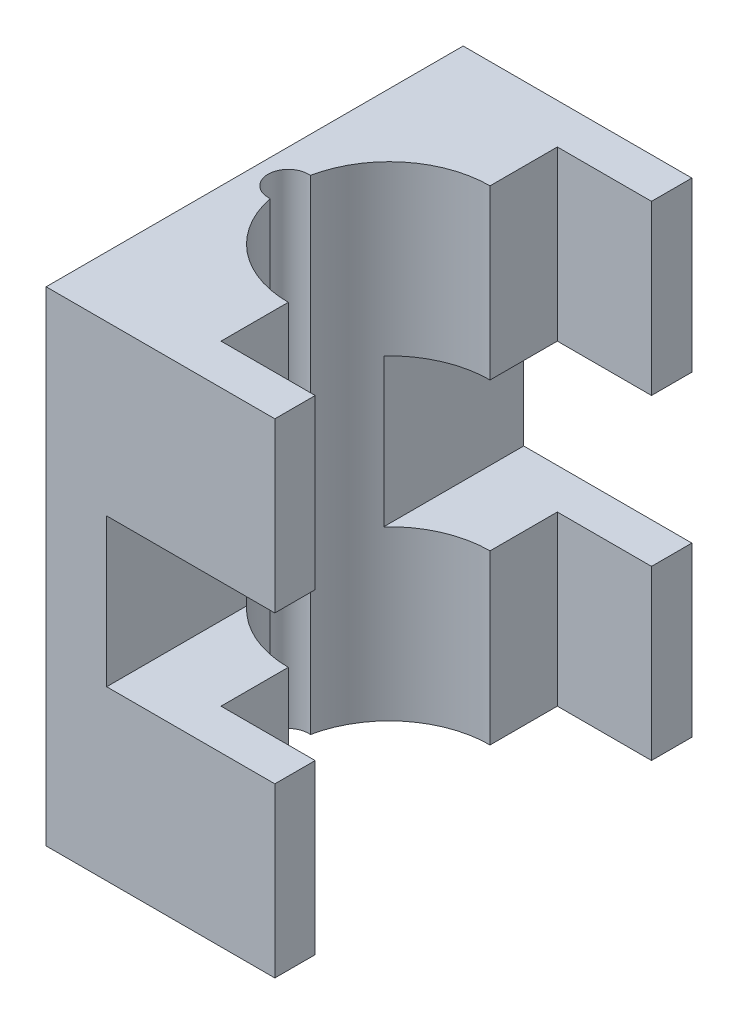
ISO-10303-21;
HEADER;
FILE_DESCRIPTION(('STEP AP214'),'2;1');
FILE_NAME('part.step','',(''),(''),'','','');
FILE_SCHEMA(('AUTOMOTIVE_DESIGN { 1 0 10303 214 1 1 1 1 }'));
ENDSEC;
DATA;
#1=APPLICATION_CONTEXT('core data for automotive mechanical design processes');
#2=APPLICATION_PROTOCOL_DEFINITION('international standard','automotive_design',2000,#1);
#3=PRODUCT_CONTEXT('',#1,'mechanical');
#4=PRODUCT('Part','Part','',(#3));
#5=PRODUCT_RELATED_PRODUCT_CATEGORY('part','',(#4));
#6=PRODUCT_DEFINITION_FORMATION('','',#4);
#7=PRODUCT_DEFINITION_CONTEXT('part definition',#1,'design');
#8=PRODUCT_DEFINITION('design','',#6,#7);
#9=PRODUCT_DEFINITION_SHAPE('','',#8);
#10=(LENGTH_UNIT() NAMED_UNIT(*) SI_UNIT(.MILLI.,.METRE.));
#11=(NAMED_UNIT(*) PLANE_ANGLE_UNIT() SI_UNIT($,.RADIAN.));
#12=(NAMED_UNIT(*) SI_UNIT($,.STERADIAN.) SOLID_ANGLE_UNIT());
#13=UNCERTAINTY_MEASURE_WITH_UNIT(LENGTH_MEASURE(1.E-05),#10,'distance_accuracy_value','');
#14=(GEOMETRIC_REPRESENTATION_CONTEXT(3) GLOBAL_UNCERTAINTY_ASSIGNED_CONTEXT((#13)) GLOBAL_UNIT_ASSIGNED_CONTEXT((#10,
#11,#12)) REPRESENTATION_CONTEXT('',''));
#15=CARTESIAN_POINT('',(0.,0.,0.));
#16=DIRECTION('',(0.,0.,1.));
#17=DIRECTION('',(1.,0.,0.));
#18=AXIS2_PLACEMENT_3D('',#15,#16,#17);
#19=CARTESIAN_POINT('',(0.,25.,0.));
#20=DIRECTION('',(0.,1.,0.));
#21=DIRECTION('',(0.,0.,1.));
#22=AXIS2_PLACEMENT_3D('',#19,#20,#21);
#23=PLANE('',#22);
#24=DIRECTION('',(-1.,0.,0.));
#25=VECTOR('',#24,1.);
#26=CARTESIAN_POINT('',(0.,25.,-31.));
#27=LINE('',#26,#25);
#28=CARTESIAN_POINT('',(14.,25.,-31.));
#29=VERTEX_POINT('',#28);
#30=CARTESIAN_POINT('',(-11.,25.,-31.));
#31=VERTEX_POINT('',#30);
#32=EDGE_CURVE('E71',#29,#31,#27,.T.);
#33=ORIENTED_EDGE('',*,*,#32,.T.);
#34=DIRECTION('',(0.,0.,1.));
#35=VECTOR('',#34,1.);
#36=CARTESIAN_POINT('',(-11.,25.,0.));
#37=LINE('',#36,#35);
#38=CARTESIAN_POINT('',(-11.,25.,-10.1980390271856));
#39=VERTEX_POINT('',#38);
#40=EDGE_CURVE('E324',#31,#39,#37,.T.);
#41=ORIENTED_EDGE('',*,*,#40,.T.);
#42=CARTESIAN_POINT('',(0.,25.,0.));
#43=DIRECTION('',(0.,1.,0.));
#44=DIRECTION('',(0.,0.,1.));
#45=AXIS2_PLACEMENT_3D('',#42,#43,#44);
#46=CIRCLE('',#45,15.);
#47=CARTESIAN_POINT('',(0.,25.,-15.));
#48=VERTEX_POINT('',#47);
#49=EDGE_CURVE('E347',#48,#39,#46,.T.);
#50=ORIENTED_EDGE('',*,*,#49,.F.);
#51=DIRECTION('',(0.,0.,1.));
#52=VECTOR('',#51,1.);
#53=CARTESIAN_POINT('',(0.,25.,0.));
#54=LINE('',#53,#52);
#55=CARTESIAN_POINT('',(0.,25.,-25.));
#56=VERTEX_POINT('',#55);
#57=EDGE_CURVE('E351',#56,#48,#54,.T.);
#58=ORIENTED_EDGE('',*,*,#57,.F.);
#59=DIRECTION('',(-1.,0.,0.));
#60=VECTOR('',#59,1.);
#61=CARTESIAN_POINT('',(0.,25.,-25.));
#62=LINE('',#61,#60);
#63=CARTESIAN_POINT('',(14.,25.,-25.));
#64=VERTEX_POINT('',#63);
#65=EDGE_CURVE('E357',#64,#56,#62,.T.);
#66=ORIENTED_EDGE('',*,*,#65,.F.);
#67=DIRECTION('',(0.,0.,-1.));
#68=VECTOR('',#67,1.);
#69=CARTESIAN_POINT('',(14.,25.,0.));
#70=LINE('',#69,#68);
#71=EDGE_CURVE('E362',#64,#29,#70,.T.);
#72=ORIENTED_EDGE('',*,*,#71,.T.);
#73=EDGE_LOOP('',(#33,#41,#50,#58,#66,#72));
#74=FACE_BOUND('',#73,.T.);
#75=ADVANCED_FACE('F47',(#74),#23,.T.);
#76=CARTESIAN_POINT('',(-15.,25.,0.));
#77=DIRECTION('',(0.,-1.,0.));
#78=DIRECTION('',(0.,0.,-1.));
#79=AXIS2_PLACEMENT_3D('',#76,#77,#78);
#80=CYLINDRICAL_SURFACE('',#79,3.);
#81=CARTESIAN_POINT('',(-15.,0.,0.));
#82=DIRECTION('',(0.,1.,0.));
#83=DIRECTION('',(0.,0.,1.));
#84=AXIS2_PLACEMENT_3D('',#81,#82,#83);
#85=CIRCLE('',#84,3.);
#86=CARTESIAN_POINT('',(-14.7,0.,-2.98496231131986));
#87=VERTEX_POINT('',#86);
#88=CARTESIAN_POINT('',(-14.7,0.,2.98496231131986));
#89=VERTEX_POINT('',#88);
#90=EDGE_CURVE('E346',#87,#89,#85,.T.);
#91=ORIENTED_EDGE('',*,*,#90,.F.);
#92=DIRECTION('',(0.,-1.,0.));
#93=VECTOR('',#92,1.);
#94=CARTESIAN_POINT('',(-14.7,25.,-2.98496231131986));
#95=LINE('',#94,#93);
#96=CARTESIAN_POINT('',(-14.7,72.,-2.98496231131986));
#97=VERTEX_POINT('',#96);
#98=EDGE_CURVE('E11',#97,#87,#95,.T.);
#99=ORIENTED_EDGE('',*,*,#98,.F.);
#100=CARTESIAN_POINT('',(-15.,72.,0.));
#101=DIRECTION('',(0.,1.,0.));
#102=DIRECTION('',(0.,0.,1.));
#103=AXIS2_PLACEMENT_3D('',#100,#101,#102);
#104=CIRCLE('',#103,3.);
#105=CARTESIAN_POINT('',(-14.7,72.,2.98496231131986));
#106=VERTEX_POINT('',#105);
#107=EDGE_CURVE('E263',#97,#106,#104,.T.);
#108=ORIENTED_EDGE('',*,*,#107,.T.);
#109=DIRECTION('',(0.,-1.,0.));
#110=VECTOR('',#109,1.);
#111=CARTESIAN_POINT('',(-14.7,25.,2.98496231131986));
#112=LINE('',#111,#110);
#113=EDGE_CURVE('E416',#106,#89,#112,.T.);
#114=ORIENTED_EDGE('',*,*,#113,.T.);
#115=EDGE_LOOP('',(#91,#99,#108,#114));
#116=FACE_BOUND('',#115,.T.);
#117=ADVANCED_FACE('F49',(#116),#80,.F.);
#118=CARTESIAN_POINT('',(0.,25.,0.));
#119=DIRECTION('',(0.,-1.,0.));
#120=DIRECTION('',(0.,0.,-1.));
#121=AXIS2_PLACEMENT_3D('',#118,#119,#120);
#122=CYLINDRICAL_SURFACE('',#121,15.);
#123=CARTESIAN_POINT('',(0.,0.,0.));
#124=DIRECTION('',(0.,1.,0.));
#125=DIRECTION('',(0.,0.,1.));
#126=AXIS2_PLACEMENT_3D('',#123,#124,#125);
#127=CIRCLE('',#126,15.);
#128=CARTESIAN_POINT('',(0.,0.,-15.));
#129=VERTEX_POINT('',#128);
#130=EDGE_CURVE('E380',#129,#87,#127,.T.);
#131=ORIENTED_EDGE('',*,*,#130,.F.);
#132=DIRECTION('',(0.,-1.,0.));
#133=VECTOR('',#132,1.);
#134=CARTESIAN_POINT('',(0.,25.,-15.));
#135=LINE('',#134,#133);
#136=EDGE_CURVE('E56',#48,#129,#135,.T.);
#137=ORIENTED_EDGE('',*,*,#136,.F.);
#138=ORIENTED_EDGE('',*,*,#49,.T.);
#139=DIRECTION('',(0.,-1.,0.));
#140=VECTOR('',#139,1.);
#141=CARTESIAN_POINT('',(-11.,47.,-10.1980390271856));
#142=LINE('',#141,#140);
#143=CARTESIAN_POINT('',(-11.,47.,-10.1980390271856));
#144=VERTEX_POINT('',#143);
#145=EDGE_CURVE('E335',#144,#39,#142,.T.);
#146=ORIENTED_EDGE('',*,*,#145,.F.);
#147=CARTESIAN_POINT('',(0.,47.,0.));
#148=DIRECTION('',(0.,1.,0.));
#149=DIRECTION('',(0.,0.,1.));
#150=AXIS2_PLACEMENT_3D('',#147,#148,#149);
#151=CIRCLE('',#150,15.);
#152=CARTESIAN_POINT('',(0.,47.,-15.));
#153=VERTEX_POINT('',#152);
#154=EDGE_CURVE('E222',#153,#144,#151,.T.);
#155=ORIENTED_EDGE('',*,*,#154,.F.);
#156=DIRECTION('',(0.,1.,0.));
#157=VECTOR('',#156,1.);
#158=CARTESIAN_POINT('',(0.,47.,-15.));
#159=LINE('',#158,#157);
#160=CARTESIAN_POINT('',(0.,72.,-15.));
#161=VERTEX_POINT('',#160);
#162=EDGE_CURVE('E251',#153,#161,#159,.T.);
#163=ORIENTED_EDGE('',*,*,#162,.T.);
#164=CARTESIAN_POINT('',(0.,72.,0.));
#165=DIRECTION('',(0.,1.,0.));
#166=DIRECTION('',(0.,0.,1.));
#167=AXIS2_PLACEMENT_3D('',#164,#165,#166);
#168=CIRCLE('',#167,15.);
#169=EDGE_CURVE('E220',#161,#97,#168,.T.);
#170=ORIENTED_EDGE('',*,*,#169,.T.);
#171=ORIENTED_EDGE('',*,*,#98,.T.);
#172=EDGE_LOOP('',(#131,#137,#138,#146,#155,#163,#170,#171));
#173=FACE_BOUND('',#172,.T.);
#174=ADVANCED_FACE('F454',(#173),#122,.F.);
#175=CARTESIAN_POINT('',(0.,25.,0.));
#176=DIRECTION('',(1.,0.,0.));
#177=DIRECTION('',(0.,0.,-1.));
#178=AXIS2_PLACEMENT_3D('',#175,#176,#177);
#179=PLANE('',#178);
#180=DIRECTION('',(0.,0.,1.));
#181=VECTOR('',#180,1.);
#182=CARTESIAN_POINT('',(0.,0.,0.));
#183=LINE('',#182,#181);
#184=CARTESIAN_POINT('',(0.,0.,-25.));
#185=VERTEX_POINT('',#184);
#186=EDGE_CURVE('E384',#185,#129,#183,.T.);
#187=ORIENTED_EDGE('',*,*,#186,.F.);
#188=DIRECTION('',(0.,-1.,0.));
#189=VECTOR('',#188,1.);
#190=CARTESIAN_POINT('',(0.,25.,-25.));
#191=LINE('',#190,#189);
#192=EDGE_CURVE('E444',#56,#185,#191,.T.);
#193=ORIENTED_EDGE('',*,*,#192,.F.);
#194=ORIENTED_EDGE('',*,*,#57,.T.);
#195=ORIENTED_EDGE('',*,*,#136,.T.);
#196=EDGE_LOOP('',(#187,#193,#194,#195));
#197=FACE_BOUND('',#196,.T.);
#198=ADVANCED_FACE('F450',(#197),#179,.T.);
#199=CARTESIAN_POINT('',(0.,25.,-25.));
#200=DIRECTION('',(0.,0.,1.));
#201=DIRECTION('',(1.,0.,0.));
#202=AXIS2_PLACEMENT_3D('',#199,#200,#201);
#203=PLANE('',#202);
#204=DIRECTION('',(-1.,0.,0.));
#205=VECTOR('',#204,1.);
#206=CARTESIAN_POINT('',(0.,0.,-25.));
#207=LINE('',#206,#205);
#208=CARTESIAN_POINT('',(14.,0.,-25.));
#209=VERTEX_POINT('',#208);
#210=EDGE_CURVE('E388',#209,#185,#207,.T.);
#211=ORIENTED_EDGE('',*,*,#210,.F.);
#212=DIRECTION('',(0.,-1.,0.));
#213=VECTOR('',#212,1.);
#214=CARTESIAN_POINT('',(14.,25.,-25.));
#215=LINE('',#214,#213);
#216=EDGE_CURVE('E441',#64,#209,#215,.T.);
#217=ORIENTED_EDGE('',*,*,#216,.F.);
#218=ORIENTED_EDGE('',*,*,#65,.T.);
#219=ORIENTED_EDGE('',*,*,#192,.T.);
#220=EDGE_LOOP('',(#211,#217,#218,#219));
#221=FACE_BOUND('',#220,.T.);
#222=ADVANCED_FACE('F463',(#221),#203,.T.);
#223=CARTESIAN_POINT('',(14.,25.,0.));
#224=DIRECTION('',(-1.,0.,0.));
#225=DIRECTION('',(0.,0.,1.));
#226=AXIS2_PLACEMENT_3D('',#223,#224,#225);
#227=PLANE('',#226);
#228=DIRECTION('',(0.,0.,-1.));
#229=VECTOR('',#228,1.);
#230=CARTESIAN_POINT('',(14.,0.,0.));
#231=LINE('',#230,#229);
#232=CARTESIAN_POINT('',(14.,0.,-31.));
#233=VERTEX_POINT('',#232);
#234=EDGE_CURVE('E393',#209,#233,#231,.T.);
#235=ORIENTED_EDGE('',*,*,#234,.T.);
#236=DIRECTION('',(0.,-1.,0.));
#237=VECTOR('',#236,1.);
#238=CARTESIAN_POINT('',(14.,25.,-31.));
#239=LINE('',#238,#237);
#240=EDGE_CURVE('E437',#29,#233,#239,.T.);
#241=ORIENTED_EDGE('',*,*,#240,.F.);
#242=ORIENTED_EDGE('',*,*,#71,.F.);
#243=ORIENTED_EDGE('',*,*,#216,.T.);
#244=EDGE_LOOP('',(#235,#241,#242,#243));
#245=FACE_BOUND('',#244,.T.);
#246=ADVANCED_FACE('F575',(#245),#227,.F.);
#247=CARTESIAN_POINT('',(0.,25.,-31.));
#248=DIRECTION('',(0.,0.,1.));
#249=DIRECTION('',(1.,0.,0.));
#250=AXIS2_PLACEMENT_3D('',#247,#248,#249);
#251=PLANE('',#250);
#252=DIRECTION('',(-1.,0.,0.));
#253=VECTOR('',#252,1.);
#254=CARTESIAN_POINT('',(0.,0.,-31.));
#255=LINE('',#254,#253);
#256=CARTESIAN_POINT('',(-20.,0.,-31.));
#257=VERTEX_POINT('',#256);
#258=EDGE_CURVE('E396',#233,#257,#255,.T.);
#259=ORIENTED_EDGE('',*,*,#258,.T.);
#260=DIRECTION('',(0.,-1.,0.));
#261=VECTOR('',#260,1.);
#262=CARTESIAN_POINT('',(-20.,25.,-31.));
#263=LINE('',#262,#261);
#264=CARTESIAN_POINT('',(-20.,72.,-31.));
#265=VERTEX_POINT('',#264);
#266=EDGE_CURVE('E434',#265,#257,#263,.T.);
#267=ORIENTED_EDGE('',*,*,#266,.F.);
#268=DIRECTION('',(-1.,0.,0.));
#269=VECTOR('',#268,1.);
#270=CARTESIAN_POINT('',(0.,72.,-31.));
#271=LINE('',#270,#269);
#272=CARTESIAN_POINT('',(14.,72.,-31.));
#273=VERTEX_POINT('',#272);
#274=EDGE_CURVE('E289',#273,#265,#271,.T.);
#275=ORIENTED_EDGE('',*,*,#274,.F.);
#276=DIRECTION('',(0.,1.,0.));
#277=VECTOR('',#276,1.);
#278=CARTESIAN_POINT('',(14.,47.,-31.));
#279=LINE('',#278,#277);
#280=CARTESIAN_POINT('',(14.,47.,-31.));
#281=VERTEX_POINT('',#280);
#282=EDGE_CURVE('E310',#281,#273,#279,.T.);
#283=ORIENTED_EDGE('',*,*,#282,.F.);
#284=DIRECTION('',(-1.,0.,0.));
#285=VECTOR('',#284,1.);
#286=CARTESIAN_POINT('',(0.,47.,-31.));
#287=LINE('',#286,#285);
#288=CARTESIAN_POINT('',(-11.,47.,-31.));
#289=VERTEX_POINT('',#288);
#290=EDGE_CURVE('E259',#281,#289,#287,.T.);
#291=ORIENTED_EDGE('',*,*,#290,.T.);
#292=DIRECTION('',(0.,-1.,0.));
#293=VECTOR('',#292,1.);
#294=CARTESIAN_POINT('',(-11.,47.,-31.));
#295=LINE('',#294,#293);
#296=EDGE_CURVE('E328',#289,#31,#295,.T.);
#297=ORIENTED_EDGE('',*,*,#296,.T.);
#298=ORIENTED_EDGE('',*,*,#32,.F.);
#299=ORIENTED_EDGE('',*,*,#240,.T.);
#300=EDGE_LOOP('',(#259,#267,#275,#283,#291,#297,#298,#299));
#301=FACE_BOUND('',#300,.T.);
#302=ADVANCED_FACE('F476',(#301),#251,.F.);
#303=CARTESIAN_POINT('',(-20.,25.,0.));
#304=DIRECTION('',(-1.,0.,0.));
#305=DIRECTION('',(0.,0.,1.));
#306=AXIS2_PLACEMENT_3D('',#303,#304,#305);
#307=PLANE('',#306);
#308=DIRECTION('',(0.,0.,-1.));
#309=VECTOR('',#308,1.);
#310=CARTESIAN_POINT('',(-20.,0.,0.));
#311=LINE('',#310,#309);
#312=CARTESIAN_POINT('',(-20.,0.,31.));
#313=VERTEX_POINT('',#312);
#314=EDGE_CURVE('E400',#313,#257,#311,.T.);
#315=ORIENTED_EDGE('',*,*,#314,.F.);
#316=DIRECTION('',(0.,-1.,0.));
#317=VECTOR('',#316,1.);
#318=CARTESIAN_POINT('',(-20.,25.,31.));
#319=LINE('',#318,#317);
#320=CARTESIAN_POINT('',(-20.,72.,31.));
#321=VERTEX_POINT('',#320);
#322=EDGE_CURVE('E431',#321,#313,#319,.T.);
#323=ORIENTED_EDGE('',*,*,#322,.F.);
#324=DIRECTION('',(0.,0.,-1.));
#325=VECTOR('',#324,1.);
#326=CARTESIAN_POINT('',(-20.,72.,0.));
#327=LINE('',#326,#325);
#328=EDGE_CURVE('E285',#321,#265,#327,.T.);
#329=ORIENTED_EDGE('',*,*,#328,.T.);
#330=ORIENTED_EDGE('',*,*,#266,.T.);
#331=EDGE_LOOP('',(#315,#323,#329,#330));
#332=FACE_BOUND('',#331,.T.);
#333=ADVANCED_FACE('F535',(#332),#307,.T.);
#334=CARTESIAN_POINT('',(0.,25.,31.));
#335=DIRECTION('',(0.,0.,1.));
#336=DIRECTION('',(1.,0.,0.));
#337=AXIS2_PLACEMENT_3D('',#334,#335,#336);
#338=PLANE('',#337);
#339=DIRECTION('',(-1.,0.,0.));
#340=VECTOR('',#339,1.);
#341=CARTESIAN_POINT('',(0.,0.,31.));
#342=LINE('',#341,#340);
#343=CARTESIAN_POINT('',(14.,0.,31.));
#344=VERTEX_POINT('',#343);
#345=EDGE_CURVE('E404',#344,#313,#342,.T.);
#346=ORIENTED_EDGE('',*,*,#345,.F.);
#347=DIRECTION('',(0.,-1.,0.));
#348=VECTOR('',#347,1.);
#349=CARTESIAN_POINT('',(14.,25.,31.));
#350=LINE('',#349,#348);
#351=CARTESIAN_POINT('',(14.,25.,31.));
#352=VERTEX_POINT('',#351);
#353=EDGE_CURVE('E428',#352,#344,#350,.T.);
#354=ORIENTED_EDGE('',*,*,#353,.F.);
#355=DIRECTION('',(-1.,0.,0.));
#356=VECTOR('',#355,1.);
#357=CARTESIAN_POINT('',(0.,25.,31.));
#358=LINE('',#357,#356);
#359=CARTESIAN_POINT('',(-11.,25.,31.));
#360=VERTEX_POINT('',#359);
#361=EDGE_CURVE('E367',#352,#360,#358,.T.);
#362=ORIENTED_EDGE('',*,*,#361,.T.);
#363=DIRECTION('',(0.,-1.,0.));
#364=VECTOR('',#363,1.);
#365=CARTESIAN_POINT('',(-11.,47.,31.));
#366=LINE('',#365,#364);
#367=CARTESIAN_POINT('',(-11.,47.,31.));
#368=VERTEX_POINT('',#367);
#369=EDGE_CURVE('E342',#368,#360,#366,.T.);
#370=ORIENTED_EDGE('',*,*,#369,.F.);
#371=DIRECTION('',(-1.,0.,0.));
#372=VECTOR('',#371,1.);
#373=CARTESIAN_POINT('',(0.,47.,31.));
#374=LINE('',#373,#372);
#375=CARTESIAN_POINT('',(14.,47.,31.));
#376=VERTEX_POINT('',#375);
#377=EDGE_CURVE('E479',#376,#368,#374,.T.);
#378=ORIENTED_EDGE('',*,*,#377,.F.);
#379=DIRECTION('',(0.,1.,0.));
#380=VECTOR('',#379,1.);
#381=CARTESIAN_POINT('',(14.,47.,31.));
#382=LINE('',#381,#380);
#383=CARTESIAN_POINT('',(14.,72.,31.));
#384=VERTEX_POINT('',#383);
#385=EDGE_CURVE('E313',#376,#384,#382,.T.);
#386=ORIENTED_EDGE('',*,*,#385,.T.);
#387=DIRECTION('',(-1.,0.,0.));
#388=VECTOR('',#387,1.);
#389=CARTESIAN_POINT('',(0.,72.,31.));
#390=LINE('',#389,#388);
#391=EDGE_CURVE('E281',#384,#321,#390,.T.);
#392=ORIENTED_EDGE('',*,*,#391,.T.);
#393=ORIENTED_EDGE('',*,*,#322,.T.);
#394=EDGE_LOOP('',(#346,#354,#362,#370,#378,#386,#392,#393));
#395=FACE_BOUND('',#394,.T.);
#396=ADVANCED_FACE('F501',(#395),#338,.T.);
#397=CARTESIAN_POINT('',(14.,25.,0.));
#398=DIRECTION('',(-1.,0.,0.));
#399=DIRECTION('',(0.,0.,1.));
#400=AXIS2_PLACEMENT_3D('',#397,#398,#399);
#401=PLANE('',#400);
#402=DIRECTION('',(0.,0.,-1.));
#403=VECTOR('',#402,1.);
#404=CARTESIAN_POINT('',(14.,0.,0.));
#405=LINE('',#404,#403);
#406=CARTESIAN_POINT('',(14.,0.,25.));
#407=VERTEX_POINT('',#406);
#408=EDGE_CURVE('E408',#344,#407,#405,.T.);
#409=ORIENTED_EDGE('',*,*,#408,.T.);
#410=DIRECTION('',(0.,-1.,0.));
#411=VECTOR('',#410,1.);
#412=CARTESIAN_POINT('',(14.,25.,25.));
#413=LINE('',#412,#411);
#414=CARTESIAN_POINT('',(14.,25.,25.));
#415=VERTEX_POINT('',#414);
#416=EDGE_CURVE('E425',#415,#407,#413,.T.);
#417=ORIENTED_EDGE('',*,*,#416,.F.);
#418=DIRECTION('',(0.,0.,-1.));
#419=VECTOR('',#418,1.);
#420=CARTESIAN_POINT('',(14.,25.,0.));
#421=LINE('',#420,#419);
#422=EDGE_CURVE('E370',#352,#415,#421,.T.);
#423=ORIENTED_EDGE('',*,*,#422,.F.);
#424=ORIENTED_EDGE('',*,*,#353,.T.);
#425=EDGE_LOOP('',(#409,#417,#423,#424));
#426=FACE_BOUND('',#425,.T.);
#427=ADVANCED_FACE('F539',(#426),#401,.F.);
#428=CARTESIAN_POINT('',(0.,25.,25.));
#429=DIRECTION('',(0.,0.,-1.));
#430=DIRECTION('',(-1.,0.,0.));
#431=AXIS2_PLACEMENT_3D('',#428,#429,#430);
#432=PLANE('',#431);
#433=DIRECTION('',(1.,0.,0.));
#434=VECTOR('',#433,1.);
#435=CARTESIAN_POINT('',(0.,0.,25.));
#436=LINE('',#435,#434);
#437=CARTESIAN_POINT('',(0.,0.,25.));
#438=VERTEX_POINT('',#437);
#439=EDGE_CURVE('E412',#438,#407,#436,.T.);
#440=ORIENTED_EDGE('',*,*,#439,.F.);
#441=DIRECTION('',(0.,-1.,0.));
#442=VECTOR('',#441,1.);
#443=CARTESIAN_POINT('',(0.,25.,25.));
#444=LINE('',#443,#442);
#445=CARTESIAN_POINT('',(0.,25.,25.));
#446=VERTEX_POINT('',#445);
#447=EDGE_CURVE('E422',#446,#438,#444,.T.);
#448=ORIENTED_EDGE('',*,*,#447,.F.);
#449=DIRECTION('',(1.,0.,0.));
#450=VECTOR('',#449,1.);
#451=CARTESIAN_POINT('',(0.,25.,25.));
#452=LINE('',#451,#450);
#453=EDGE_CURVE('E373',#446,#415,#452,.T.);
#454=ORIENTED_EDGE('',*,*,#453,.T.);
#455=ORIENTED_EDGE('',*,*,#416,.T.);
#456=EDGE_LOOP('',(#440,#448,#454,#455));
#457=FACE_BOUND('',#456,.T.);
#458=ADVANCED_FACE('F541',(#457),#432,.T.);
#459=CARTESIAN_POINT('',(0.,0.,15.));
#460=VERTEX_POINT('',#459);
#461=EDGE_CURVE('E389',#460,#438,#183,.T.);
#462=ORIENTED_EDGE('',*,*,#461,.F.);
#463=DIRECTION('',(0.,-1.,0.));
#464=VECTOR('',#463,1.);
#465=CARTESIAN_POINT('',(0.,25.,15.));
#466=LINE('',#465,#464);
#467=CARTESIAN_POINT('',(0.,25.,15.));
#468=VERTEX_POINT('',#467);
#469=EDGE_CURVE('E419',#468,#460,#466,.T.);
#470=ORIENTED_EDGE('',*,*,#469,.F.);
#471=EDGE_CURVE('E358',#468,#446,#54,.T.);
#472=ORIENTED_EDGE('',*,*,#471,.T.);
#473=ORIENTED_EDGE('',*,*,#447,.T.);
#474=EDGE_LOOP('',(#462,#470,#472,#473));
#475=FACE_BOUND('',#474,.T.);
#476=ADVANCED_FACE('F512',(#475),#179,.T.);
#477=EDGE_CURVE('E352',#89,#460,#127,.T.);
#478=ORIENTED_EDGE('',*,*,#477,.F.);
#479=ORIENTED_EDGE('',*,*,#113,.F.);
#480=CARTESIAN_POINT('',(0.,72.,15.));
#481=VERTEX_POINT('',#480);
#482=EDGE_CURVE('E228',#106,#481,#168,.T.);
#483=ORIENTED_EDGE('',*,*,#482,.T.);
#484=DIRECTION('',(0.,1.,0.));
#485=VECTOR('',#484,1.);
#486=CARTESIAN_POINT('',(0.,47.,15.));
#487=LINE('',#486,#485);
#488=CARTESIAN_POINT('',(0.,47.,15.));
#489=VERTEX_POINT('',#488);
#490=EDGE_CURVE('E224',#489,#481,#487,.T.);
#491=ORIENTED_EDGE('',*,*,#490,.F.);
#492=CARTESIAN_POINT('',(-11.,47.,10.1980390271856));
#493=VERTEX_POINT('',#492);
#494=EDGE_CURVE('E208',#493,#489,#151,.T.);
#495=ORIENTED_EDGE('',*,*,#494,.F.);
#496=DIRECTION('',(0.,-1.,0.));
#497=VECTOR('',#496,1.);
#498=CARTESIAN_POINT('',(-11.,47.,10.1980390271856));
#499=LINE('',#498,#497);
#500=CARTESIAN_POINT('',(-11.,25.,10.1980390271856));
#501=VERTEX_POINT('',#500);
#502=EDGE_CURVE('E339',#493,#501,#499,.T.);
#503=ORIENTED_EDGE('',*,*,#502,.T.);
#504=EDGE_CURVE('E353',#501,#468,#46,.T.);
#505=ORIENTED_EDGE('',*,*,#504,.T.);
#506=ORIENTED_EDGE('',*,*,#469,.T.);
#507=EDGE_LOOP('',(#478,#479,#483,#491,#495,#503,#505,#506));
#508=FACE_BOUND('',#507,.T.);
#509=ADVANCED_FACE('F226',(#508),#122,.F.);
#510=DIRECTION('',(0.,0.,-1.));
#511=VECTOR('',#510,1.);
#512=CARTESIAN_POINT('',(-11.,25.,0.));
#513=LINE('',#512,#511);
#514=EDGE_CURVE('E63',#360,#501,#513,.T.);
#515=ORIENTED_EDGE('',*,*,#514,.F.);
#516=ORIENTED_EDGE('',*,*,#361,.F.);
#517=ORIENTED_EDGE('',*,*,#422,.T.);
#518=ORIENTED_EDGE('',*,*,#453,.F.);
#519=ORIENTED_EDGE('',*,*,#471,.F.);
#520=ORIENTED_EDGE('',*,*,#504,.F.);
#521=EDGE_LOOP('',(#515,#516,#517,#518,#519,#520));
#522=FACE_BOUND('',#521,.T.);
#523=ADVANCED_FACE('F516',(#522),#23,.T.);
#524=CARTESIAN_POINT('',(0.,0.,0.));
#525=DIRECTION('',(0.,1.,0.));
#526=DIRECTION('',(0.,0.,1.));
#527=AXIS2_PLACEMENT_3D('',#524,#525,#526);
#528=PLANE('',#527);
#529=ORIENTED_EDGE('',*,*,#90,.T.);
#530=ORIENTED_EDGE('',*,*,#477,.T.);
#531=ORIENTED_EDGE('',*,*,#461,.T.);
#532=ORIENTED_EDGE('',*,*,#439,.T.);
#533=ORIENTED_EDGE('',*,*,#408,.F.);
#534=ORIENTED_EDGE('',*,*,#345,.T.);
#535=ORIENTED_EDGE('',*,*,#314,.T.);
#536=ORIENTED_EDGE('',*,*,#258,.F.);
#537=ORIENTED_EDGE('',*,*,#234,.F.);
#538=ORIENTED_EDGE('',*,*,#210,.T.);
#539=ORIENTED_EDGE('',*,*,#186,.T.);
#540=ORIENTED_EDGE('',*,*,#130,.T.);
#541=EDGE_LOOP('',(#529,#530,#531,#532,#533,#534,#535,#536,#537,#538,#539,#540));
#542=FACE_BOUND('',#541,.T.);
#543=ADVANCED_FACE('F458',(#542),#528,.F.);
#544=CARTESIAN_POINT('',(-11.,47.,0.));
#545=DIRECTION('',(-1.,0.,0.));
#546=DIRECTION('',(0.,0.,1.));
#547=AXIS2_PLACEMENT_3D('',#544,#545,#546);
#548=PLANE('',#547);
#549=ORIENTED_EDGE('',*,*,#514,.T.);
#550=ORIENTED_EDGE('',*,*,#502,.F.);
#551=DIRECTION('',(0.,0.,-1.));
#552=VECTOR('',#551,1.);
#553=CARTESIAN_POINT('',(-11.,47.,0.));
#554=LINE('',#553,#552);
#555=EDGE_CURVE('E215',#368,#493,#554,.T.);
#556=ORIENTED_EDGE('',*,*,#555,.F.);
#557=ORIENTED_EDGE('',*,*,#369,.T.);
#558=EDGE_LOOP('',(#549,#550,#556,#557));
#559=FACE_BOUND('',#558,.T.);
#560=ADVANCED_FACE('F505',(#559),#548,.F.);
#561=CARTESIAN_POINT('',(-11.,47.,0.));
#562=DIRECTION('',(1.,0.,0.));
#563=DIRECTION('',(0.,0.,-1.));
#564=AXIS2_PLACEMENT_3D('',#561,#562,#563);
#565=PLANE('',#564);
#566=ORIENTED_EDGE('',*,*,#40,.F.);
#567=ORIENTED_EDGE('',*,*,#296,.F.);
#568=DIRECTION('',(0.,0.,1.));
#569=VECTOR('',#568,1.);
#570=CARTESIAN_POINT('',(-11.,47.,0.));
#571=LINE('',#570,#569);
#572=EDGE_CURVE('E323',#289,#144,#571,.T.);
#573=ORIENTED_EDGE('',*,*,#572,.T.);
#574=ORIENTED_EDGE('',*,*,#145,.T.);
#575=EDGE_LOOP('',(#566,#567,#573,#574));
#576=FACE_BOUND('',#575,.T.);
#577=ADVANCED_FACE('F470',(#576),#565,.T.);
#578=CARTESIAN_POINT('',(0.,47.,0.));
#579=DIRECTION('',(0.,-1.,0.));
#580=DIRECTION('',(0.,0.,1.));
#581=AXIS2_PLACEMENT_3D('',#578,#579,#580);
#582=PLANE('',#581);
#583=ORIENTED_EDGE('',*,*,#572,.F.);
#584=ORIENTED_EDGE('',*,*,#290,.F.);
#585=DIRECTION('',(0.,0.,-1.));
#586=VECTOR('',#585,1.);
#587=CARTESIAN_POINT('',(14.,47.,0.));
#588=LINE('',#587,#586);
#589=CARTESIAN_POINT('',(14.,47.,-25.));
#590=VERTEX_POINT('',#589);
#591=EDGE_CURVE('E252',#590,#281,#588,.T.);
#592=ORIENTED_EDGE('',*,*,#591,.F.);
#593=DIRECTION('',(-1.,0.,0.));
#594=VECTOR('',#593,1.);
#595=CARTESIAN_POINT('',(0.,47.,-25.));
#596=LINE('',#595,#594);
#597=CARTESIAN_POINT('',(0.,47.,-25.));
#598=VERTEX_POINT('',#597);
#599=EDGE_CURVE('E245',#590,#598,#596,.T.);
#600=ORIENTED_EDGE('',*,*,#599,.T.);
#601=DIRECTION('',(0.,0.,1.));
#602=VECTOR('',#601,1.);
#603=CARTESIAN_POINT('',(0.,47.,0.));
#604=LINE('',#603,#602);
#605=EDGE_CURVE('E240',#598,#153,#604,.T.);
#606=ORIENTED_EDGE('',*,*,#605,.T.);
#607=ORIENTED_EDGE('',*,*,#154,.T.);
#608=EDGE_LOOP('',(#583,#584,#592,#600,#606,#607));
#609=FACE_BOUND('',#608,.T.);
#610=ADVANCED_FACE('F474',(#609),#582,.T.);
#611=CARTESIAN_POINT('',(0.,47.,0.));
#612=DIRECTION('',(-1.,0.,0.));
#613=DIRECTION('',(0.,0.,1.));
#614=AXIS2_PLACEMENT_3D('',#611,#612,#613);
#615=PLANE('',#614);
#616=DIRECTION('',(0.,0.,1.));
#617=VECTOR('',#616,1.);
#618=CARTESIAN_POINT('',(0.,72.,0.));
#619=LINE('',#618,#617);
#620=CARTESIAN_POINT('',(0.,72.,25.));
#621=VERTEX_POINT('',#620);
#622=EDGE_CURVE('E269',#481,#621,#619,.T.);
#623=ORIENTED_EDGE('',*,*,#622,.T.);
#624=DIRECTION('',(0.,1.,0.));
#625=VECTOR('',#624,1.);
#626=CARTESIAN_POINT('',(0.,47.,25.));
#627=LINE('',#626,#625);
#628=CARTESIAN_POINT('',(0.,47.,25.));
#629=VERTEX_POINT('',#628);
#630=EDGE_CURVE('E232',#629,#621,#627,.T.);
#631=ORIENTED_EDGE('',*,*,#630,.F.);
#632=EDGE_CURVE('E212',#489,#629,#604,.T.);
#633=ORIENTED_EDGE('',*,*,#632,.F.);
#634=ORIENTED_EDGE('',*,*,#490,.T.);
#635=EDGE_LOOP('',(#623,#631,#633,#634));
#636=FACE_BOUND('',#635,.T.);
#637=ADVANCED_FACE('F234',(#636),#615,.F.);
#638=CARTESIAN_POINT('',(0.,47.,25.));
#639=DIRECTION('',(0.,0.,1.));
#640=DIRECTION('',(1.,0.,0.));
#641=AXIS2_PLACEMENT_3D('',#638,#639,#640);
#642=PLANE('',#641);
#643=DIRECTION('',(1.,0.,0.));
#644=VECTOR('',#643,1.);
#645=CARTESIAN_POINT('',(0.,72.,25.));
#646=LINE('',#645,#644);
#647=CARTESIAN_POINT('',(14.,72.,25.));
#648=VERTEX_POINT('',#647);
#649=EDGE_CURVE('E272',#621,#648,#646,.T.);
#650=ORIENTED_EDGE('',*,*,#649,.T.);
#651=DIRECTION('',(0.,1.,0.));
#652=VECTOR('',#651,1.);
#653=CARTESIAN_POINT('',(14.,47.,25.));
#654=LINE('',#653,#652);
#655=CARTESIAN_POINT('',(14.,47.,25.));
#656=VERTEX_POINT('',#655);
#657=EDGE_CURVE('E316',#656,#648,#654,.T.);
#658=ORIENTED_EDGE('',*,*,#657,.F.);
#659=DIRECTION('',(1.,0.,0.));
#660=VECTOR('',#659,1.);
#661=CARTESIAN_POINT('',(0.,47.,25.));
#662=LINE('',#661,#660);
#663=EDGE_CURVE('E238',#629,#656,#662,.T.);
#664=ORIENTED_EDGE('',*,*,#663,.F.);
#665=ORIENTED_EDGE('',*,*,#630,.T.);
#666=EDGE_LOOP('',(#650,#658,#664,#665));
#667=FACE_BOUND('',#666,.T.);
#668=ADVANCED_FACE('F492',(#667),#642,.F.);
#669=CARTESIAN_POINT('',(14.,47.,0.));
#670=DIRECTION('',(1.,0.,0.));
#671=DIRECTION('',(0.,0.,-1.));
#672=AXIS2_PLACEMENT_3D('',#669,#670,#671);
#673=PLANE('',#672);
#674=DIRECTION('',(0.,0.,-1.));
#675=VECTOR('',#674,1.);
#676=CARTESIAN_POINT('',(14.,72.,0.));
#677=LINE('',#676,#675);
#678=EDGE_CURVE('E277',#384,#648,#677,.T.);
#679=ORIENTED_EDGE('',*,*,#678,.F.);
#680=ORIENTED_EDGE('',*,*,#385,.F.);
#681=DIRECTION('',(0.,0.,-1.));
#682=VECTOR('',#681,1.);
#683=CARTESIAN_POINT('',(14.,47.,0.));
#684=LINE('',#683,#682);
#685=EDGE_CURVE('E242',#376,#656,#684,.T.);
#686=ORIENTED_EDGE('',*,*,#685,.T.);
#687=ORIENTED_EDGE('',*,*,#657,.T.);
#688=EDGE_LOOP('',(#679,#680,#686,#687));
#689=FACE_BOUND('',#688,.T.);
#690=ADVANCED_FACE('F488',(#689),#673,.T.);
#691=CARTESIAN_POINT('',(14.,47.,0.));
#692=DIRECTION('',(1.,0.,0.));
#693=DIRECTION('',(0.,0.,-1.));
#694=AXIS2_PLACEMENT_3D('',#691,#692,#693);
#695=PLANE('',#694);
#696=DIRECTION('',(0.,0.,-1.));
#697=VECTOR('',#696,1.);
#698=CARTESIAN_POINT('',(14.,72.,0.));
#699=LINE('',#698,#697);
#700=CARTESIAN_POINT('',(14.,72.,-25.));
#701=VERTEX_POINT('',#700);
#702=EDGE_CURVE('E293',#701,#273,#699,.T.);
#703=ORIENTED_EDGE('',*,*,#702,.F.);
#704=DIRECTION('',(0.,1.,0.));
#705=VECTOR('',#704,1.);
#706=CARTESIAN_POINT('',(14.,47.,-25.));
#707=LINE('',#706,#705);
#708=EDGE_CURVE('E307',#590,#701,#707,.T.);
#709=ORIENTED_EDGE('',*,*,#708,.F.);
#710=ORIENTED_EDGE('',*,*,#591,.T.);
#711=ORIENTED_EDGE('',*,*,#282,.T.);
#712=EDGE_LOOP('',(#703,#709,#710,#711));
#713=FACE_BOUND('',#712,.T.);
#714=ADVANCED_FACE('F533',(#713),#695,.T.);
#715=CARTESIAN_POINT('',(0.,47.,-25.));
#716=DIRECTION('',(0.,0.,-1.));
#717=DIRECTION('',(-1.,0.,0.));
#718=AXIS2_PLACEMENT_3D('',#715,#716,#717);
#719=PLANE('',#718);
#720=DIRECTION('',(-1.,0.,0.));
#721=VECTOR('',#720,1.);
#722=CARTESIAN_POINT('',(0.,72.,-25.));
#723=LINE('',#722,#721);
#724=CARTESIAN_POINT('',(0.,72.,-25.));
#725=VERTEX_POINT('',#724);
#726=EDGE_CURVE('E297',#701,#725,#723,.T.);
#727=ORIENTED_EDGE('',*,*,#726,.T.);
#728=DIRECTION('',(0.,1.,0.));
#729=VECTOR('',#728,1.);
#730=CARTESIAN_POINT('',(0.,47.,-25.));
#731=LINE('',#730,#729);
#732=EDGE_CURVE('E303',#598,#725,#731,.T.);
#733=ORIENTED_EDGE('',*,*,#732,.F.);
#734=ORIENTED_EDGE('',*,*,#599,.F.);
#735=ORIENTED_EDGE('',*,*,#708,.T.);
#736=EDGE_LOOP('',(#727,#733,#734,#735));
#737=FACE_BOUND('',#736,.T.);
#738=ADVANCED_FACE('F680',(#737),#719,.F.);
#739=EDGE_CURVE('E273',#725,#161,#619,.T.);
#740=ORIENTED_EDGE('',*,*,#739,.T.);
#741=ORIENTED_EDGE('',*,*,#162,.F.);
#742=ORIENTED_EDGE('',*,*,#605,.F.);
#743=ORIENTED_EDGE('',*,*,#732,.T.);
#744=EDGE_LOOP('',(#740,#741,#742,#743));
#745=FACE_BOUND('',#744,.T.);
#746=ADVANCED_FACE('F528',(#745),#615,.F.);
#747=ORIENTED_EDGE('',*,*,#377,.T.);
#748=ORIENTED_EDGE('',*,*,#555,.T.);
#749=ORIENTED_EDGE('',*,*,#494,.T.);
#750=ORIENTED_EDGE('',*,*,#632,.T.);
#751=ORIENTED_EDGE('',*,*,#663,.T.);
#752=ORIENTED_EDGE('',*,*,#685,.F.);
#753=EDGE_LOOP('',(#747,#748,#749,#750,#751,#752));
#754=FACE_BOUND('',#753,.T.);
#755=ADVANCED_FACE('F210',(#754),#582,.T.);
#756=CARTESIAN_POINT('',(0.,72.,0.));
#757=DIRECTION('',(0.,-1.,0.));
#758=DIRECTION('',(0.,0.,1.));
#759=AXIS2_PLACEMENT_3D('',#756,#757,#758);
#760=PLANE('',#759);
#761=ORIENTED_EDGE('',*,*,#107,.F.);
#762=ORIENTED_EDGE('',*,*,#169,.F.);
#763=ORIENTED_EDGE('',*,*,#739,.F.);
#764=ORIENTED_EDGE('',*,*,#726,.F.);
#765=ORIENTED_EDGE('',*,*,#702,.T.);
#766=ORIENTED_EDGE('',*,*,#274,.T.);
#767=ORIENTED_EDGE('',*,*,#328,.F.);
#768=ORIENTED_EDGE('',*,*,#391,.F.);
#769=ORIENTED_EDGE('',*,*,#678,.T.);
#770=ORIENTED_EDGE('',*,*,#649,.F.);
#771=ORIENTED_EDGE('',*,*,#622,.F.);
#772=ORIENTED_EDGE('',*,*,#482,.F.);
#773=EDGE_LOOP('',(#761,#762,#763,#764,#765,#766,#767,#768,#769,#770,#771,#772));
#774=FACE_BOUND('',#773,.T.);
#775=ADVANCED_FACE('F497',(#774),#760,.F.);
#776=CLOSED_SHELL('',(#75,#117,#174,#198,#222,#246,#302,#333,#396,#427,#458,#476,#509,#523,#543,
#560,#577,#610,#637,#668,#690,#714,#738,#746,#755,#775));
#777=MANIFOLD_SOLID_BREP('B2',#776);
#778=ADVANCED_BREP_SHAPE_REPRESENTATION('',(#18,#777),#14);
#779=SHAPE_DEFINITION_REPRESENTATION(#9,#778);
ENDSEC;
END-ISO-10303-21;
